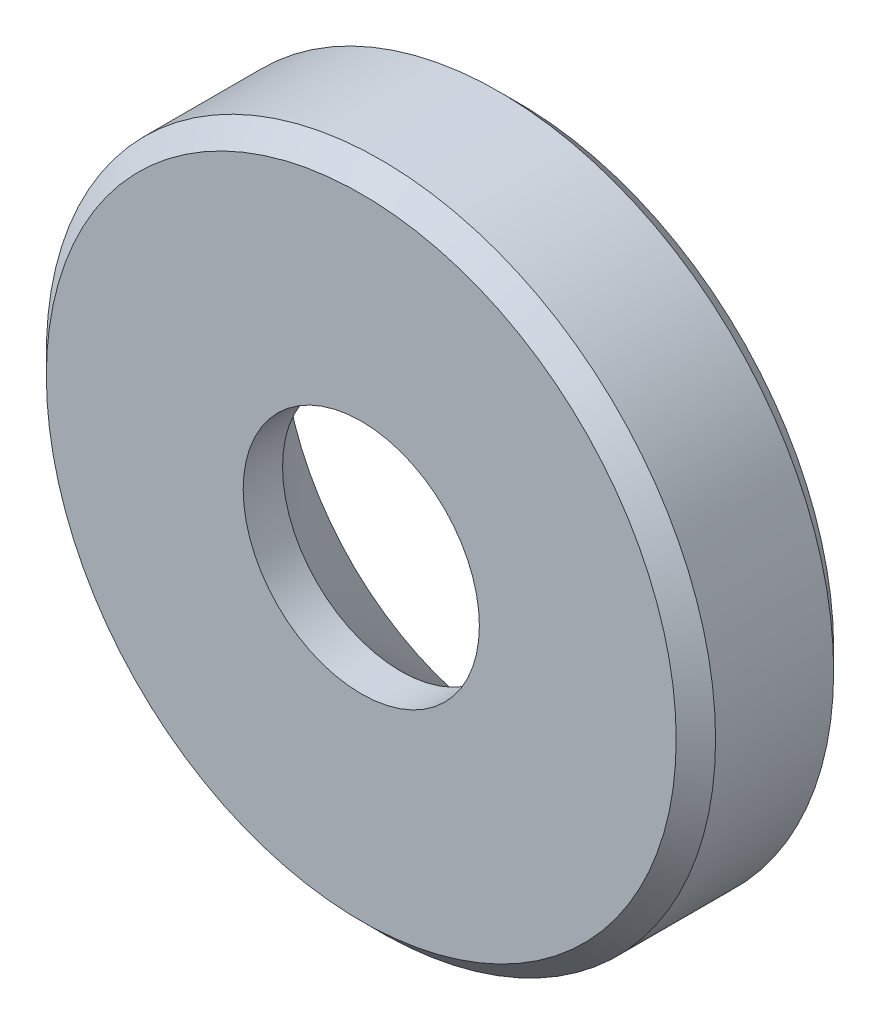
ISO-10303-21;
HEADER;
FILE_DESCRIPTION(('STEP AP214'),'2;1');
FILE_NAME('part.step','',(''),(''),'','','');
FILE_SCHEMA(('AUTOMOTIVE_DESIGN { 1 0 10303 214 1 1 1 1 }'));
ENDSEC;
DATA;
#1=APPLICATION_CONTEXT('core data for automotive mechanical design processes');
#2=APPLICATION_PROTOCOL_DEFINITION('international standard','automotive_design',2000,#1);
#3=PRODUCT_CONTEXT('',#1,'mechanical');
#4=PRODUCT('Part','Part','',(#3));
#5=PRODUCT_RELATED_PRODUCT_CATEGORY('part','',(#4));
#6=PRODUCT_DEFINITION_FORMATION('','',#4);
#7=PRODUCT_DEFINITION_CONTEXT('part definition',#1,'design');
#8=PRODUCT_DEFINITION('design','',#6,#7);
#9=PRODUCT_DEFINITION_SHAPE('','',#8);
#10=(LENGTH_UNIT() NAMED_UNIT(*) SI_UNIT(.MILLI.,.METRE.));
#11=(NAMED_UNIT(*) PLANE_ANGLE_UNIT() SI_UNIT($,.RADIAN.));
#12=(NAMED_UNIT(*) SI_UNIT($,.STERADIAN.) SOLID_ANGLE_UNIT());
#13=UNCERTAINTY_MEASURE_WITH_UNIT(LENGTH_MEASURE(1.E-05),#10,'distance_accuracy_value','');
#14=(GEOMETRIC_REPRESENTATION_CONTEXT(3) GLOBAL_UNCERTAINTY_ASSIGNED_CONTEXT((#13)) GLOBAL_UNIT_ASSIGNED_CONTEXT((#10,
#11,#12)) REPRESENTATION_CONTEXT('',''));
#15=CARTESIAN_POINT('',(0.,0.,0.));
#16=DIRECTION('',(0.,0.,1.));
#17=DIRECTION('',(1.,0.,0.));
#18=AXIS2_PLACEMENT_3D('',#15,#16,#17);
#19=CARTESIAN_POINT('',(0.,0.,8.));
#20=DIRECTION('',(0.,0.,-1.));
#21=DIRECTION('',(-1.,0.,0.));
#22=AXIS2_PLACEMENT_3D('',#19,#20,#21);
#23=CYLINDRICAL_SURFACE('',#22,17.);
#24=CARTESIAN_POINT('',(0.,0.,7.));
#25=DIRECTION('',(0.,0.,1.));
#26=DIRECTION('',(1.,0.,0.));
#27=AXIS2_PLACEMENT_3D('',#24,#25,#26);
#28=CIRCLE('',#27,17.);
#29=CARTESIAN_POINT('',(17.,0.,7.));
#30=VERTEX_POINT('',#29);
#31=EDGE_CURVE('E48',#30,#30,#28,.F.);
#32=ORIENTED_EDGE('',*,*,#31,.T.);
#33=EDGE_LOOP('',(#32));
#34=FACE_BOUND('',#33,.T.);
#35=CARTESIAN_POINT('',(0.,0.,1.));
#36=DIRECTION('',(0.,0.,1.));
#37=DIRECTION('',(1.,0.,0.));
#38=AXIS2_PLACEMENT_3D('',#35,#36,#37);
#39=CIRCLE('',#38,17.);
#40=CARTESIAN_POINT('',(17.,0.,1.));
#41=VERTEX_POINT('',#40);
#42=EDGE_CURVE('E53',#41,#41,#39,.T.);
#43=ORIENTED_EDGE('',*,*,#42,.T.);
#44=EDGE_LOOP('',(#43));
#45=FACE_BOUND('',#44,.T.);
#46=ADVANCED_FACE('F39',(#34,#45),#23,.T.);
#47=CARTESIAN_POINT('',(0.,0.,8.));
#48=DIRECTION('',(0.,0.,1.));
#49=DIRECTION('',(1.,0.,0.));
#50=AXIS2_PLACEMENT_3D('',#47,#48,#49);
#51=PLANE('',#50);
#52=CARTESIAN_POINT('',(0.,0.,8.));
#53=DIRECTION('',(0.,0.,1.));
#54=DIRECTION('',(1.,0.,0.));
#55=AXIS2_PLACEMENT_3D('',#52,#53,#54);
#56=CIRCLE('',#55,16.);
#57=CARTESIAN_POINT('',(16.,0.,8.));
#58=VERTEX_POINT('',#57);
#59=EDGE_CURVE('E58',#58,#58,#56,.T.);
#60=ORIENTED_EDGE('',*,*,#59,.T.);
#61=EDGE_LOOP('',(#60));
#62=FACE_BOUND('',#61,.T.);
#63=CARTESIAN_POINT('',(0.,0.,8.));
#64=DIRECTION('',(0.,0.,-1.));
#65=DIRECTION('',(-1.,0.,0.));
#66=AXIS2_PLACEMENT_3D('',#63,#64,#65);
#67=CIRCLE('',#66,6.);
#68=CARTESIAN_POINT('',(-6.,0.,8.));
#69=VERTEX_POINT('',#68);
#70=EDGE_CURVE('E64',#69,#69,#67,.T.);
#71=ORIENTED_EDGE('',*,*,#70,.T.);
#72=EDGE_LOOP('',(#71));
#73=FACE_BOUND('',#72,.T.);
#74=ADVANCED_FACE('F83',(#62,#73),#51,.T.);
#75=CARTESIAN_POINT('',(0.,0.,0.));
#76=DIRECTION('',(0.,0.,1.));
#77=DIRECTION('',(1.,0.,0.));
#78=AXIS2_PLACEMENT_3D('',#75,#76,#77);
#79=PLANE('',#78);
#80=CARTESIAN_POINT('',(0.,0.,0.));
#81=DIRECTION('',(0.,0.,1.));
#82=DIRECTION('',(1.,0.,0.));
#83=AXIS2_PLACEMENT_3D('',#80,#81,#82);
#84=CIRCLE('',#83,16.);
#85=CARTESIAN_POINT('',(16.,0.,0.));
#86=VERTEX_POINT('',#85);
#87=EDGE_CURVE('E10',#86,#86,#84,.F.);
#88=ORIENTED_EDGE('',*,*,#87,.T.);
#89=EDGE_LOOP('',(#88));
#90=FACE_BOUND('',#89,.T.);
#91=CARTESIAN_POINT('',(0.,0.,0.));
#92=DIRECTION('',(0.,0.,-1.));
#93=DIRECTION('',(-1.,0.,0.));
#94=AXIS2_PLACEMENT_3D('',#91,#92,#93);
#95=CIRCLE('',#94,12.);
#96=CARTESIAN_POINT('',(-12.,0.,0.));
#97=VERTEX_POINT('',#96);
#98=EDGE_CURVE('E72',#97,#97,#95,.T.);
#99=ORIENTED_EDGE('',*,*,#98,.F.);
#100=EDGE_LOOP('',(#99));
#101=FACE_BOUND('',#100,.T.);
#102=ADVANCED_FACE('F80',(#90,#101),#79,.F.);
#103=CARTESIAN_POINT('',(0.,0.,0.));
#104=DIRECTION('',(0.,0.,-1.));
#105=DIRECTION('',(-1.,0.,0.));
#106=AXIS2_PLACEMENT_3D('',#103,#104,#105);
#107=CYLINDRICAL_SURFACE('',#106,6.);
#108=CARTESIAN_POINT('',(0.,0.,6.));
#109=DIRECTION('',(0.,0.,-1.));
#110=DIRECTION('',(-1.,0.,0.));
#111=AXIS2_PLACEMENT_3D('',#108,#109,#110);
#112=CIRCLE('',#111,6.);
#113=CARTESIAN_POINT('',(-6.,0.,6.));
#114=VERTEX_POINT('',#113);
#115=EDGE_CURVE('E68',#114,#114,#112,.T.);
#116=ORIENTED_EDGE('',*,*,#115,.T.);
#117=EDGE_LOOP('',(#116));
#118=FACE_BOUND('',#117,.T.);
#119=ORIENTED_EDGE('',*,*,#70,.F.);
#120=EDGE_LOOP('',(#119));
#121=FACE_BOUND('',#120,.T.);
#122=ADVANCED_FACE('F82',(#118,#121),#107,.F.);
#123=CARTESIAN_POINT('',(0.,0.,6.));
#124=DIRECTION('',(0.,0.,-1.));
#125=DIRECTION('',(-1.,0.,0.));
#126=AXIS2_PLACEMENT_3D('',#123,#124,#125);
#127=CONICAL_SURFACE('',#126,6.,0.785398163397447);
#128=ORIENTED_EDGE('',*,*,#98,.T.);
#129=EDGE_LOOP('',(#128));
#130=FACE_BOUND('',#129,.T.);
#131=ORIENTED_EDGE('',*,*,#115,.F.);
#132=EDGE_LOOP('',(#131));
#133=FACE_BOUND('',#132,.T.);
#134=ADVANCED_FACE('F77',(#130,#133),#127,.F.);
#135=CARTESIAN_POINT('',(0.,0.,8.));
#136=DIRECTION('',(0.,0.,-1.));
#137=DIRECTION('',(-1.,0.,0.));
#138=AXIS2_PLACEMENT_3D('',#135,#136,#137);
#139=CONICAL_SURFACE('',#138,16.,0.78539816339745);
#140=ORIENTED_EDGE('',*,*,#31,.F.);
#141=EDGE_LOOP('',(#140));
#142=FACE_BOUND('',#141,.T.);
#143=ORIENTED_EDGE('',*,*,#59,.F.);
#144=EDGE_LOOP('',(#143));
#145=FACE_BOUND('',#144,.T.);
#146=ADVANCED_FACE('F99',(#142,#145),#139,.T.);
#147=CARTESIAN_POINT('',(0.,0.,1.));
#148=DIRECTION('',(0.,0.,1.));
#149=DIRECTION('',(1.,0.,0.));
#150=AXIS2_PLACEMENT_3D('',#147,#148,#149);
#151=CONICAL_SURFACE('',#150,17.,0.78539816339745);
#152=ORIENTED_EDGE('',*,*,#87,.F.);
#153=EDGE_LOOP('',(#152));
#154=FACE_BOUND('',#153,.T.);
#155=ORIENTED_EDGE('',*,*,#42,.F.);
#156=EDGE_LOOP('',(#155));
#157=FACE_BOUND('',#156,.T.);
#158=ADVANCED_FACE('F42',(#154,#157),#151,.T.);
#159=CLOSED_SHELL('',(#46,#74,#102,#122,#134,#146,#158));
#160=MANIFOLD_SOLID_BREP('B2',#159);
#161=ADVANCED_BREP_SHAPE_REPRESENTATION('',(#18,#160),#14);
#162=SHAPE_DEFINITION_REPRESENTATION(#9,#161);
ENDSEC;
END-ISO-10303-21;
